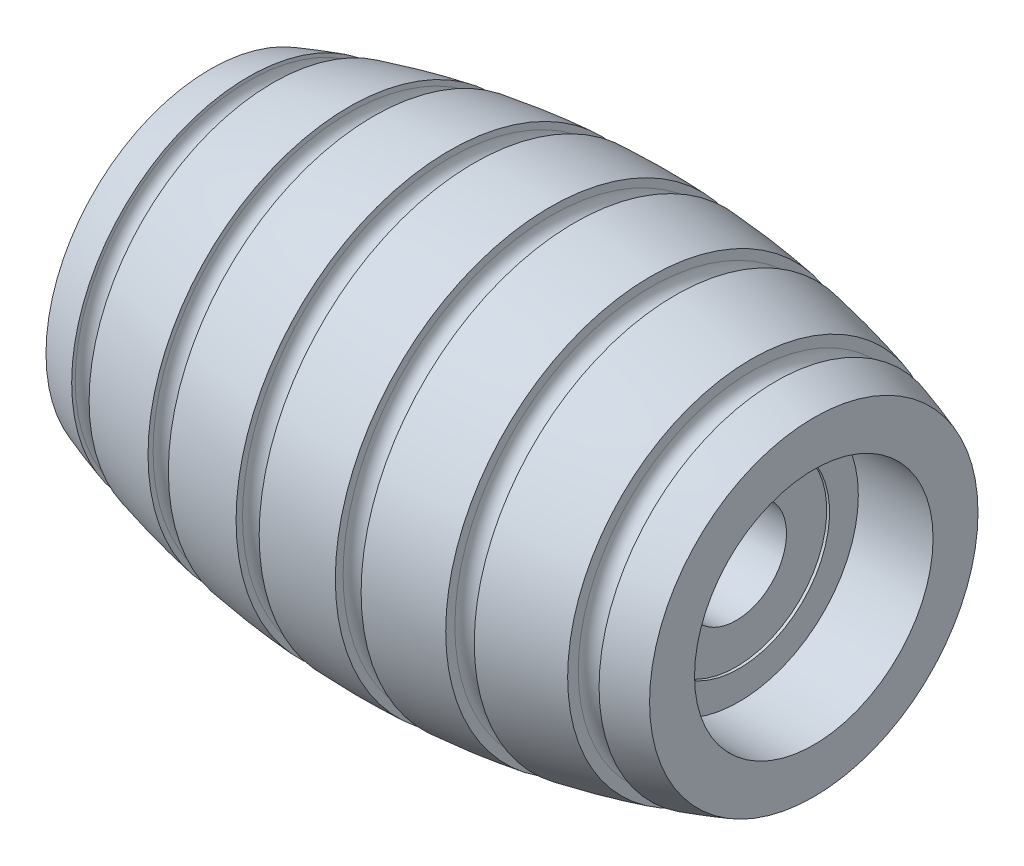
ISO-10303-21;
HEADER;
FILE_DESCRIPTION(('STEP AP214'),'2;1');
FILE_NAME('part.step','',(''),(''),'','','');
FILE_SCHEMA(('AUTOMOTIVE_DESIGN { 1 0 10303 214 1 1 1 1 }'));
ENDSEC;
DATA;
#1=APPLICATION_CONTEXT('core data for automotive mechanical design processes');
#2=APPLICATION_PROTOCOL_DEFINITION('international standard','automotive_design',2000,#1);
#3=PRODUCT_CONTEXT('',#1,'mechanical');
#4=PRODUCT('Part','Part','',(#3));
#5=PRODUCT_RELATED_PRODUCT_CATEGORY('part','',(#4));
#6=PRODUCT_DEFINITION_FORMATION('','',#4);
#7=PRODUCT_DEFINITION_CONTEXT('part definition',#1,'design');
#8=PRODUCT_DEFINITION('design','',#6,#7);
#9=PRODUCT_DEFINITION_SHAPE('','',#8);
#10=(LENGTH_UNIT() NAMED_UNIT(*) SI_UNIT(.MILLI.,.METRE.));
#11=(NAMED_UNIT(*) PLANE_ANGLE_UNIT() SI_UNIT($,.RADIAN.));
#12=(NAMED_UNIT(*) SI_UNIT($,.STERADIAN.) SOLID_ANGLE_UNIT());
#13=UNCERTAINTY_MEASURE_WITH_UNIT(LENGTH_MEASURE(1.E-05),#10,'distance_accuracy_value','');
#14=(GEOMETRIC_REPRESENTATION_CONTEXT(3) GLOBAL_UNCERTAINTY_ASSIGNED_CONTEXT((#13)) GLOBAL_UNIT_ASSIGNED_CONTEXT((#10,
#11,#12)) REPRESENTATION_CONTEXT('',''));
#15=CARTESIAN_POINT('',(0.,0.,0.));
#16=DIRECTION('',(0.,0.,1.));
#17=DIRECTION('',(1.,0.,0.));
#18=AXIS2_PLACEMENT_3D('',#15,#16,#17);
#19=CARTESIAN_POINT('',(0.,0.,0.));
#20=DIRECTION('',(-1.,0.,0.));
#21=DIRECTION('',(0.,0.,1.));
#22=AXIS2_PLACEMENT_3D('',#19,#20,#21);
#23=DEGENERATE_TOROIDAL_SURFACE('',#22,48.5,63.5,.F.);
#24=CARTESIAN_POINT('',(-21.,0.,0.));
#25=DIRECTION('',(-1.,0.,0.));
#26=DIRECTION('',(0.,0.,1.));
#27=AXIS2_PLACEMENT_3D('',#24,#25,#26);
#28=CIRCLE('',#27,11.4270389724038);
#29=CARTESIAN_POINT('',(-21.,0.,11.4270389724038));
#30=VERTEX_POINT('',#29);
#31=EDGE_CURVE('E143',#30,#30,#28,.T.);
#32=ORIENTED_EDGE('',*,*,#31,.F.);
#33=EDGE_LOOP('',(#32));
#34=FACE_BOUND('',#33,.T.);
#35=CARTESIAN_POINT('',(-18.35,0.,0.));
#36=DIRECTION('',(-1.,0.,0.));
#37=DIRECTION('',(0.,0.,1.));
#38=AXIS2_PLACEMENT_3D('',#35,#36,#37);
#39=CIRCLE('',#38,12.290850462878);
#40=CARTESIAN_POINT('',(-18.35,0.,12.290850462878));
#41=VERTEX_POINT('',#40);
#42=EDGE_CURVE('E10',#41,#41,#39,.T.);
#43=ORIENTED_EDGE('',*,*,#42,.T.);
#44=EDGE_LOOP('',(#43));
#45=FACE_BOUND('',#44,.T.);
#46=ADVANCED_FACE('F31',(#34,#45),#23,.F.);
#47=CARTESIAN_POINT('',(-18.35,12.290850462878,0.));
#48=DIRECTION('',(-1.,0.,0.));
#49=DIRECTION('',(0.,0.,1.));
#50=AXIS2_PLACEMENT_3D('',#47,#48,#49);
#51=PLANE('',#50);
#52=ORIENTED_EDGE('',*,*,#42,.F.);
#53=EDGE_LOOP('',(#52));
#54=FACE_BOUND('',#53,.T.);
#55=CARTESIAN_POINT('',(-18.35,0.,0.));
#56=DIRECTION('',(-1.,0.,0.));
#57=DIRECTION('',(0.,0.,1.));
#58=AXIS2_PLACEMENT_3D('',#55,#56,#57);
#59=CIRCLE('',#58,12.0409698481274);
#60=CARTESIAN_POINT('',(-18.35,0.,12.0409698481274));
#61=VERTEX_POINT('',#60);
#62=EDGE_CURVE('E37',#61,#61,#59,.T.);
#63=ORIENTED_EDGE('',*,*,#62,.T.);
#64=EDGE_LOOP('',(#63));
#65=FACE_BOUND('',#64,.T.);
#66=ADVANCED_FACE('F150',(#54,#65),#51,.F.);
#67=CARTESIAN_POINT('',(-17.5,0.,0.));
#68=DIRECTION('',(-1.,0.,0.));
#69=DIRECTION('',(0.,0.,1.));
#70=AXIS2_PLACEMENT_3D('',#67,#68,#69);
#71=TOROIDAL_SURFACE('',#70,12.0409698481274,0.85);
#72=ORIENTED_EDGE('',*,*,#62,.F.);
#73=EDGE_LOOP('',(#72));
#74=FACE_BOUND('',#73,.T.);
#75=CARTESIAN_POINT('',(-16.65,0.,0.));
#76=DIRECTION('',(-1.,0.,0.));
#77=DIRECTION('',(0.,0.,1.));
#78=AXIS2_PLACEMENT_3D('',#75,#76,#77);
#79=CIRCLE('',#78,12.0409698481274);
#80=CARTESIAN_POINT('',(-16.65,0.,12.0409698481274));
#81=VERTEX_POINT('',#80);
#82=EDGE_CURVE('E41',#81,#81,#79,.T.);
#83=ORIENTED_EDGE('',*,*,#82,.T.);
#84=EDGE_LOOP('',(#83));
#85=FACE_BOUND('',#84,.T.);
#86=ADVANCED_FACE('F154',(#74,#85),#71,.F.);
#87=CARTESIAN_POINT('',(-16.65,12.0409698481274,0.));
#88=DIRECTION('',(1.,0.,0.));
#89=DIRECTION('',(0.,0.,-1.));
#90=AXIS2_PLACEMENT_3D('',#87,#88,#89);
#91=PLANE('',#90);
#92=ORIENTED_EDGE('',*,*,#82,.F.);
#93=EDGE_LOOP('',(#92));
#94=FACE_BOUND('',#93,.T.);
#95=CARTESIAN_POINT('',(-16.65,0.,0.));
#96=DIRECTION('',(-1.,0.,0.));
#97=DIRECTION('',(0.,0.,1.));
#98=AXIS2_PLACEMENT_3D('',#95,#96,#97);
#99=CIRCLE('',#98,12.7782791860215);
#100=CARTESIAN_POINT('',(-16.65,0.,12.7782791860215));
#101=VERTEX_POINT('',#100);
#102=EDGE_CURVE('E45',#101,#101,#99,.T.);
#103=ORIENTED_EDGE('',*,*,#102,.T.);
#104=EDGE_LOOP('',(#103));
#105=FACE_BOUND('',#104,.T.);
#106=ADVANCED_FACE('F159',(#94,#105),#91,.F.);
#107=CARTESIAN_POINT('',(0.,0.,0.));
#108=DIRECTION('',(-1.,0.,0.));
#109=DIRECTION('',(0.,0.,1.));
#110=AXIS2_PLACEMENT_3D('',#107,#108,#109);
#111=DEGENERATE_TOROIDAL_SURFACE('',#110,48.5,63.5,.F.);
#112=ORIENTED_EDGE('',*,*,#102,.F.);
#113=EDGE_LOOP('',(#112));
#114=FACE_BOUND('',#113,.T.);
#115=CARTESIAN_POINT('',(-11.35,0.,0.));
#116=DIRECTION('',(-1.,0.,0.));
#117=DIRECTION('',(0.,0.,1.));
#118=AXIS2_PLACEMENT_3D('',#115,#116,#117);
#119=CIRCLE('',#118,13.9774159196745);
#120=CARTESIAN_POINT('',(-11.35,0.,13.9774159196745));
#121=VERTEX_POINT('',#120);
#122=EDGE_CURVE('E50',#121,#121,#119,.T.);
#123=ORIENTED_EDGE('',*,*,#122,.T.);
#124=EDGE_LOOP('',(#123));
#125=FACE_BOUND('',#124,.T.);
#126=ADVANCED_FACE('F165',(#114,#125),#111,.F.);
#127=CARTESIAN_POINT('',(-11.35,13.9774159196745,0.));
#128=DIRECTION('',(-1.,0.,0.));
#129=DIRECTION('',(0.,0.,1.));
#130=AXIS2_PLACEMENT_3D('',#127,#128,#129);
#131=PLANE('',#130);
#132=ORIENTED_EDGE('',*,*,#122,.F.);
#133=EDGE_LOOP('',(#132));
#134=FACE_BOUND('',#133,.T.);
#135=CARTESIAN_POINT('',(-11.35,0.,0.));
#136=DIRECTION('',(-1.,0.,0.));
#137=DIRECTION('',(0.,0.,1.));
#138=AXIS2_PLACEMENT_3D('',#135,#136,#137);
#139=CIRCLE('',#138,13.6258732474047);
#140=CARTESIAN_POINT('',(-11.35,0.,13.6258732474047));
#141=VERTEX_POINT('',#140);
#142=EDGE_CURVE('E53',#141,#141,#139,.T.);
#143=ORIENTED_EDGE('',*,*,#142,.T.);
#144=EDGE_LOOP('',(#143));
#145=FACE_BOUND('',#144,.T.);
#146=ADVANCED_FACE('F169',(#134,#145),#131,.F.);
#147=CARTESIAN_POINT('',(-10.5,0.,0.));
#148=DIRECTION('',(-1.,0.,0.));
#149=DIRECTION('',(0.,0.,1.));
#150=AXIS2_PLACEMENT_3D('',#147,#148,#149);
#151=TOROIDAL_SURFACE('',#150,13.6258732474047,0.85);
#152=ORIENTED_EDGE('',*,*,#142,.F.);
#153=EDGE_LOOP('',(#152));
#154=FACE_BOUND('',#153,.T.);
#155=CARTESIAN_POINT('',(-9.65,0.,0.));
#156=DIRECTION('',(-1.,0.,0.));
#157=DIRECTION('',(0.,0.,1.));
#158=AXIS2_PLACEMENT_3D('',#155,#156,#157);
#159=CIRCLE('',#158,13.6258732474047);
#160=CARTESIAN_POINT('',(-9.65,0.,13.6258732474047));
#161=VERTEX_POINT('',#160);
#162=EDGE_CURVE('E56',#161,#161,#159,.T.);
#163=ORIENTED_EDGE('',*,*,#162,.T.);
#164=EDGE_LOOP('',(#163));
#165=FACE_BOUND('',#164,.T.);
#166=ADVANCED_FACE('F173',(#154,#165),#151,.F.);
#167=CARTESIAN_POINT('',(-9.65,13.6258732474047,0.));
#168=DIRECTION('',(1.,0.,0.));
#169=DIRECTION('',(0.,0.,-1.));
#170=AXIS2_PLACEMENT_3D('',#167,#168,#169);
#171=PLANE('',#170);
#172=ORIENTED_EDGE('',*,*,#162,.F.);
#173=EDGE_LOOP('',(#172));
#174=FACE_BOUND('',#173,.T.);
#175=CARTESIAN_POINT('',(-9.65,0.,0.));
#176=DIRECTION('',(-1.,0.,0.));
#177=DIRECTION('',(0.,0.,1.));
#178=AXIS2_PLACEMENT_3D('',#175,#176,#177);
#179=CIRCLE('',#178,14.2624688806933);
#180=CARTESIAN_POINT('',(-9.65,0.,14.2624688806933));
#181=VERTEX_POINT('',#180);
#182=EDGE_CURVE('E59',#181,#181,#179,.T.);
#183=ORIENTED_EDGE('',*,*,#182,.T.);
#184=EDGE_LOOP('',(#183));
#185=FACE_BOUND('',#184,.T.);
#186=ADVANCED_FACE('F177',(#174,#185),#171,.F.);
#187=CARTESIAN_POINT('',(0.,0.,0.));
#188=DIRECTION('',(-1.,0.,0.));
#189=DIRECTION('',(0.,0.,1.));
#190=AXIS2_PLACEMENT_3D('',#187,#188,#189);
#191=DEGENERATE_TOROIDAL_SURFACE('',#190,48.5,63.5,.F.);
#192=ORIENTED_EDGE('',*,*,#182,.F.);
#193=EDGE_LOOP('',(#192));
#194=FACE_BOUND('',#193,.T.);
#195=CARTESIAN_POINT('',(-4.35,0.,0.));
#196=DIRECTION('',(-1.,0.,0.));
#197=DIRECTION('',(0.,0.,1.));
#198=AXIS2_PLACEMENT_3D('',#195,#196,#197);
#199=CIRCLE('',#198,14.8508287238612);
#200=CARTESIAN_POINT('',(-4.35,0.,14.8508287238612));
#201=VERTEX_POINT('',#200);
#202=EDGE_CURVE('E62',#201,#201,#199,.T.);
#203=ORIENTED_EDGE('',*,*,#202,.T.);
#204=EDGE_LOOP('',(#203));
#205=FACE_BOUND('',#204,.T.);
#206=ADVANCED_FACE('F181',(#194,#205),#191,.F.);
#207=CARTESIAN_POINT('',(-4.35,14.8508287238612,0.));
#208=DIRECTION('',(-1.,0.,0.));
#209=DIRECTION('',(0.,0.,1.));
#210=AXIS2_PLACEMENT_3D('',#207,#208,#209);
#211=PLANE('',#210);
#212=ORIENTED_EDGE('',*,*,#202,.F.);
#213=EDGE_LOOP('',(#212));
#214=FACE_BOUND('',#213,.T.);
#215=CARTESIAN_POINT('',(-4.35,0.,0.));
#216=DIRECTION('',(-1.,0.,0.));
#217=DIRECTION('',(0.,0.,1.));
#218=AXIS2_PLACEMENT_3D('',#215,#216,#217);
#219=CIRCLE('',#218,14.4034699365894);
#220=CARTESIAN_POINT('',(-4.35,0.,14.4034699365894));
#221=VERTEX_POINT('',#220);
#222=EDGE_CURVE('E65',#221,#221,#219,.T.);
#223=ORIENTED_EDGE('',*,*,#222,.T.);
#224=EDGE_LOOP('',(#223));
#225=FACE_BOUND('',#224,.T.);
#226=ADVANCED_FACE('F185',(#214,#225),#211,.F.);
#227=CARTESIAN_POINT('',(-3.5,0.,0.));
#228=DIRECTION('',(-1.,0.,0.));
#229=DIRECTION('',(0.,0.,1.));
#230=AXIS2_PLACEMENT_3D('',#227,#228,#229);
#231=TOROIDAL_SURFACE('',#230,14.4034699365894,0.849999999999998);
#232=ORIENTED_EDGE('',*,*,#222,.F.);
#233=EDGE_LOOP('',(#232));
#234=FACE_BOUND('',#233,.T.);
#235=CARTESIAN_POINT('',(-2.65000000000001,0.,0.));
#236=DIRECTION('',(-1.,0.,0.));
#237=DIRECTION('',(0.,0.,1.));
#238=AXIS2_PLACEMENT_3D('',#235,#236,#237);
#239=CIRCLE('',#238,14.4034699365894);
#240=CARTESIAN_POINT('',(-2.65000000000001,0.,14.4034699365894));
#241=VERTEX_POINT('',#240);
#242=EDGE_CURVE('E68',#241,#241,#239,.T.);
#243=ORIENTED_EDGE('',*,*,#242,.T.);
#244=EDGE_LOOP('',(#243));
#245=FACE_BOUND('',#244,.T.);
#246=ADVANCED_FACE('F189',(#234,#245),#231,.F.);
#247=CARTESIAN_POINT('',(-2.65,14.4034699365894,0.));
#248=DIRECTION('',(1.,0.,0.));
#249=DIRECTION('',(0.,0.,-1.));
#250=AXIS2_PLACEMENT_3D('',#247,#248,#249);
#251=PLANE('',#250);
#252=ORIENTED_EDGE('',*,*,#242,.F.);
#253=EDGE_LOOP('',(#252));
#254=FACE_BOUND('',#253,.T.);
#255=CARTESIAN_POINT('',(-2.65,0.,0.));
#256=DIRECTION('',(-1.,0.,0.));
#257=DIRECTION('',(0.,0.,1.));
#258=AXIS2_PLACEMENT_3D('',#255,#256,#257);
#259=CIRCLE('',#258,14.9446806280873);
#260=CARTESIAN_POINT('',(-2.65,0.,14.9446806280873));
#261=VERTEX_POINT('',#260);
#262=EDGE_CURVE('E71',#261,#261,#259,.T.);
#263=ORIENTED_EDGE('',*,*,#262,.T.);
#264=EDGE_LOOP('',(#263));
#265=FACE_BOUND('',#264,.T.);
#266=ADVANCED_FACE('F193',(#254,#265),#251,.F.);
#267=CARTESIAN_POINT('',(0.,0.,0.));
#268=DIRECTION('',(-1.,0.,0.));
#269=DIRECTION('',(0.,0.,1.));
#270=AXIS2_PLACEMENT_3D('',#267,#268,#269);
#271=DEGENERATE_TOROIDAL_SURFACE('',#270,48.5,63.5,.F.);
#272=ORIENTED_EDGE('',*,*,#262,.F.);
#273=EDGE_LOOP('',(#272));
#274=FACE_BOUND('',#273,.T.);
#275=CARTESIAN_POINT('',(2.65,0.,0.));
#276=DIRECTION('',(-1.,0.,0.));
#277=DIRECTION('',(0.,0.,1.));
#278=AXIS2_PLACEMENT_3D('',#275,#276,#277);
#279=CIRCLE('',#278,14.9446806280873);
#280=CARTESIAN_POINT('',(2.65,0.,14.9446806280873));
#281=VERTEX_POINT('',#280);
#282=EDGE_CURVE('E74',#281,#281,#279,.T.);
#283=ORIENTED_EDGE('',*,*,#282,.T.);
#284=EDGE_LOOP('',(#283));
#285=FACE_BOUND('',#284,.T.);
#286=ADVANCED_FACE('F197',(#274,#285),#271,.F.);
#287=CARTESIAN_POINT('',(2.65,14.9446806280873,0.));
#288=DIRECTION('',(-1.,0.,0.));
#289=DIRECTION('',(0.,0.,1.));
#290=AXIS2_PLACEMENT_3D('',#287,#288,#289);
#291=PLANE('',#290);
#292=ORIENTED_EDGE('',*,*,#282,.F.);
#293=EDGE_LOOP('',(#292));
#294=FACE_BOUND('',#293,.T.);
#295=CARTESIAN_POINT('',(2.65,0.,0.));
#296=DIRECTION('',(-1.,0.,0.));
#297=DIRECTION('',(0.,0.,1.));
#298=AXIS2_PLACEMENT_3D('',#295,#296,#297);
#299=CIRCLE('',#298,14.4034699365894);
#300=CARTESIAN_POINT('',(2.65,0.,14.4034699365894));
#301=VERTEX_POINT('',#300);
#302=EDGE_CURVE('E77',#301,#301,#299,.T.);
#303=ORIENTED_EDGE('',*,*,#302,.T.);
#304=EDGE_LOOP('',(#303));
#305=FACE_BOUND('',#304,.T.);
#306=ADVANCED_FACE('F201',(#294,#305),#291,.F.);
#307=CARTESIAN_POINT('',(3.5,0.,0.));
#308=DIRECTION('',(-1.,0.,0.));
#309=DIRECTION('',(0.,0.,1.));
#310=AXIS2_PLACEMENT_3D('',#307,#308,#309);
#311=TOROIDAL_SURFACE('',#310,14.4034699365894,0.850000000000002);
#312=ORIENTED_EDGE('',*,*,#302,.F.);
#313=EDGE_LOOP('',(#312));
#314=FACE_BOUND('',#313,.T.);
#315=CARTESIAN_POINT('',(4.35,0.,0.));
#316=DIRECTION('',(-1.,0.,0.));
#317=DIRECTION('',(0.,0.,1.));
#318=AXIS2_PLACEMENT_3D('',#315,#316,#317);
#319=CIRCLE('',#318,14.4034699365894);
#320=CARTESIAN_POINT('',(4.35,0.,14.4034699365894));
#321=VERTEX_POINT('',#320);
#322=EDGE_CURVE('E80',#321,#321,#319,.T.);
#323=ORIENTED_EDGE('',*,*,#322,.T.);
#324=EDGE_LOOP('',(#323));
#325=FACE_BOUND('',#324,.T.);
#326=ADVANCED_FACE('F205',(#314,#325),#311,.F.);
#327=CARTESIAN_POINT('',(4.35,14.4034699365894,0.));
#328=DIRECTION('',(1.,0.,0.));
#329=DIRECTION('',(0.,0.,-1.));
#330=AXIS2_PLACEMENT_3D('',#327,#328,#329);
#331=PLANE('',#330);
#332=ORIENTED_EDGE('',*,*,#322,.F.);
#333=EDGE_LOOP('',(#332));
#334=FACE_BOUND('',#333,.T.);
#335=CARTESIAN_POINT('',(4.35000000000001,0.,0.));
#336=DIRECTION('',(-1.,0.,0.));
#337=DIRECTION('',(0.,0.,1.));
#338=AXIS2_PLACEMENT_3D('',#335,#336,#337);
#339=CIRCLE('',#338,14.8508287238612);
#340=CARTESIAN_POINT('',(4.35000000000001,0.,14.8508287238612));
#341=VERTEX_POINT('',#340);
#342=EDGE_CURVE('E83',#341,#341,#339,.T.);
#343=ORIENTED_EDGE('',*,*,#342,.T.);
#344=EDGE_LOOP('',(#343));
#345=FACE_BOUND('',#344,.T.);
#346=ADVANCED_FACE('F209',(#334,#345),#331,.F.);
#347=CARTESIAN_POINT('',(0.,0.,0.));
#348=DIRECTION('',(-1.,0.,0.));
#349=DIRECTION('',(0.,0.,1.));
#350=AXIS2_PLACEMENT_3D('',#347,#348,#349);
#351=DEGENERATE_TOROIDAL_SURFACE('',#350,48.5,63.5,.F.);
#352=ORIENTED_EDGE('',*,*,#342,.F.);
#353=EDGE_LOOP('',(#352));
#354=FACE_BOUND('',#353,.T.);
#355=CARTESIAN_POINT('',(9.65,0.,0.));
#356=DIRECTION('',(-1.,0.,0.));
#357=DIRECTION('',(0.,0.,1.));
#358=AXIS2_PLACEMENT_3D('',#355,#356,#357);
#359=CIRCLE('',#358,14.2624688806933);
#360=CARTESIAN_POINT('',(9.65,0.,14.2624688806933));
#361=VERTEX_POINT('',#360);
#362=EDGE_CURVE('E86',#361,#361,#359,.T.);
#363=ORIENTED_EDGE('',*,*,#362,.T.);
#364=EDGE_LOOP('',(#363));
#365=FACE_BOUND('',#364,.T.);
#366=ADVANCED_FACE('F213',(#354,#365),#351,.F.);
#367=CARTESIAN_POINT('',(9.65,14.2624688806933,0.));
#368=DIRECTION('',(-1.,0.,0.));
#369=DIRECTION('',(0.,0.,1.));
#370=AXIS2_PLACEMENT_3D('',#367,#368,#369);
#371=PLANE('',#370);
#372=ORIENTED_EDGE('',*,*,#362,.F.);
#373=EDGE_LOOP('',(#372));
#374=FACE_BOUND('',#373,.T.);
#375=CARTESIAN_POINT('',(9.65,0.,0.));
#376=DIRECTION('',(-1.,0.,0.));
#377=DIRECTION('',(0.,0.,1.));
#378=AXIS2_PLACEMENT_3D('',#375,#376,#377);
#379=CIRCLE('',#378,13.6258732474047);
#380=CARTESIAN_POINT('',(9.65,0.,13.6258732474047));
#381=VERTEX_POINT('',#380);
#382=EDGE_CURVE('E89',#381,#381,#379,.T.);
#383=ORIENTED_EDGE('',*,*,#382,.T.);
#384=EDGE_LOOP('',(#383));
#385=FACE_BOUND('',#384,.T.);
#386=ADVANCED_FACE('F217',(#374,#385),#371,.F.);
#387=CARTESIAN_POINT('',(10.5,0.,0.));
#388=DIRECTION('',(-1.,0.,0.));
#389=DIRECTION('',(0.,0.,1.));
#390=AXIS2_PLACEMENT_3D('',#387,#388,#389);
#391=TOROIDAL_SURFACE('',#390,13.6258732474047,0.85);
#392=ORIENTED_EDGE('',*,*,#382,.F.);
#393=EDGE_LOOP('',(#392));
#394=FACE_BOUND('',#393,.T.);
#395=CARTESIAN_POINT('',(11.35,0.,0.));
#396=DIRECTION('',(-1.,0.,0.));
#397=DIRECTION('',(0.,0.,1.));
#398=AXIS2_PLACEMENT_3D('',#395,#396,#397);
#399=CIRCLE('',#398,13.6258732474047);
#400=CARTESIAN_POINT('',(11.35,0.,13.6258732474047));
#401=VERTEX_POINT('',#400);
#402=EDGE_CURVE('E92',#401,#401,#399,.T.);
#403=ORIENTED_EDGE('',*,*,#402,.T.);
#404=EDGE_LOOP('',(#403));
#405=FACE_BOUND('',#404,.T.);
#406=ADVANCED_FACE('F221',(#394,#405),#391,.F.);
#407=CARTESIAN_POINT('',(11.35,13.6258732474047,0.));
#408=DIRECTION('',(1.,0.,0.));
#409=DIRECTION('',(0.,0.,-1.));
#410=AXIS2_PLACEMENT_3D('',#407,#408,#409);
#411=PLANE('',#410);
#412=ORIENTED_EDGE('',*,*,#402,.F.);
#413=EDGE_LOOP('',(#412));
#414=FACE_BOUND('',#413,.T.);
#415=CARTESIAN_POINT('',(11.35,0.,0.));
#416=DIRECTION('',(-1.,0.,0.));
#417=DIRECTION('',(0.,0.,1.));
#418=AXIS2_PLACEMENT_3D('',#415,#416,#417);
#419=CIRCLE('',#418,13.9774159196745);
#420=CARTESIAN_POINT('',(11.35,0.,13.9774159196745));
#421=VERTEX_POINT('',#420);
#422=EDGE_CURVE('E95',#421,#421,#419,.T.);
#423=ORIENTED_EDGE('',*,*,#422,.T.);
#424=EDGE_LOOP('',(#423));
#425=FACE_BOUND('',#424,.T.);
#426=ADVANCED_FACE('F225',(#414,#425),#411,.F.);
#427=CARTESIAN_POINT('',(0.,0.,0.));
#428=DIRECTION('',(-1.,0.,0.));
#429=DIRECTION('',(0.,0.,1.));
#430=AXIS2_PLACEMENT_3D('',#427,#428,#429);
#431=DEGENERATE_TOROIDAL_SURFACE('',#430,48.5,63.5,.F.);
#432=ORIENTED_EDGE('',*,*,#422,.F.);
#433=EDGE_LOOP('',(#432));
#434=FACE_BOUND('',#433,.T.);
#435=CARTESIAN_POINT('',(16.65,0.,0.));
#436=DIRECTION('',(-1.,0.,0.));
#437=DIRECTION('',(0.,0.,1.));
#438=AXIS2_PLACEMENT_3D('',#435,#436,#437);
#439=CIRCLE('',#438,12.7782791860215);
#440=CARTESIAN_POINT('',(16.65,0.,12.7782791860215));
#441=VERTEX_POINT('',#440);
#442=EDGE_CURVE('E98',#441,#441,#439,.T.);
#443=ORIENTED_EDGE('',*,*,#442,.T.);
#444=EDGE_LOOP('',(#443));
#445=FACE_BOUND('',#444,.T.);
#446=ADVANCED_FACE('F229',(#434,#445),#431,.F.);
#447=CARTESIAN_POINT('',(16.65,12.7782791860215,0.));
#448=DIRECTION('',(-1.,0.,0.));
#449=DIRECTION('',(0.,0.,1.));
#450=AXIS2_PLACEMENT_3D('',#447,#448,#449);
#451=PLANE('',#450);
#452=ORIENTED_EDGE('',*,*,#442,.F.);
#453=EDGE_LOOP('',(#452));
#454=FACE_BOUND('',#453,.T.);
#455=CARTESIAN_POINT('',(16.65,0.,0.));
#456=DIRECTION('',(-1.,0.,0.));
#457=DIRECTION('',(0.,0.,1.));
#458=AXIS2_PLACEMENT_3D('',#455,#456,#457);
#459=CIRCLE('',#458,12.0409698481274);
#460=CARTESIAN_POINT('',(16.65,0.,12.0409698481274));
#461=VERTEX_POINT('',#460);
#462=EDGE_CURVE('E101',#461,#461,#459,.T.);
#463=ORIENTED_EDGE('',*,*,#462,.T.);
#464=EDGE_LOOP('',(#463));
#465=FACE_BOUND('',#464,.T.);
#466=ADVANCED_FACE('F233',(#454,#465),#451,.F.);
#467=CARTESIAN_POINT('',(17.5,0.,0.));
#468=DIRECTION('',(-1.,0.,0.));
#469=DIRECTION('',(0.,0.,1.));
#470=AXIS2_PLACEMENT_3D('',#467,#468,#469);
#471=TOROIDAL_SURFACE('',#470,12.0409698481274,0.849999999999995);
#472=ORIENTED_EDGE('',*,*,#462,.F.);
#473=EDGE_LOOP('',(#472));
#474=FACE_BOUND('',#473,.T.);
#475=CARTESIAN_POINT('',(18.35,0.,0.));
#476=DIRECTION('',(-1.,0.,0.));
#477=DIRECTION('',(0.,0.,1.));
#478=AXIS2_PLACEMENT_3D('',#475,#476,#477);
#479=CIRCLE('',#478,12.0409698481274);
#480=CARTESIAN_POINT('',(18.35,0.,12.0409698481274));
#481=VERTEX_POINT('',#480);
#482=EDGE_CURVE('E104',#481,#481,#479,.T.);
#483=ORIENTED_EDGE('',*,*,#482,.T.);
#484=EDGE_LOOP('',(#483));
#485=FACE_BOUND('',#484,.T.);
#486=ADVANCED_FACE('F237',(#474,#485),#471,.F.);
#487=CARTESIAN_POINT('',(18.35,12.0409698481274,0.));
#488=DIRECTION('',(1.,0.,0.));
#489=DIRECTION('',(0.,0.,-1.));
#490=AXIS2_PLACEMENT_3D('',#487,#488,#489);
#491=PLANE('',#490);
#492=ORIENTED_EDGE('',*,*,#482,.F.);
#493=EDGE_LOOP('',(#492));
#494=FACE_BOUND('',#493,.T.);
#495=CARTESIAN_POINT('',(18.35,0.,0.));
#496=DIRECTION('',(-1.,0.,0.));
#497=DIRECTION('',(0.,0.,1.));
#498=AXIS2_PLACEMENT_3D('',#495,#496,#497);
#499=CIRCLE('',#498,12.290850462878);
#500=CARTESIAN_POINT('',(18.35,0.,12.290850462878));
#501=VERTEX_POINT('',#500);
#502=EDGE_CURVE('E107',#501,#501,#499,.T.);
#503=ORIENTED_EDGE('',*,*,#502,.T.);
#504=EDGE_LOOP('',(#503));
#505=FACE_BOUND('',#504,.T.);
#506=ADVANCED_FACE('F241',(#494,#505),#491,.F.);
#507=CARTESIAN_POINT('',(0.,0.,0.));
#508=DIRECTION('',(-1.,0.,0.));
#509=DIRECTION('',(0.,0.,1.));
#510=AXIS2_PLACEMENT_3D('',#507,#508,#509);
#511=DEGENERATE_TOROIDAL_SURFACE('',#510,48.5,63.5,.F.);
#512=ORIENTED_EDGE('',*,*,#502,.F.);
#513=EDGE_LOOP('',(#512));
#514=FACE_BOUND('',#513,.T.);
#515=CARTESIAN_POINT('',(21.,0.,0.));
#516=DIRECTION('',(-1.,0.,0.));
#517=DIRECTION('',(0.,0.,1.));
#518=AXIS2_PLACEMENT_3D('',#515,#516,#517);
#519=CIRCLE('',#518,11.4270389724038);
#520=CARTESIAN_POINT('',(21.,0.,11.4270389724038));
#521=VERTEX_POINT('',#520);
#522=EDGE_CURVE('E110',#521,#521,#519,.T.);
#523=ORIENTED_EDGE('',*,*,#522,.T.);
#524=EDGE_LOOP('',(#523));
#525=FACE_BOUND('',#524,.T.);
#526=ADVANCED_FACE('F245',(#514,#525),#511,.F.);
#527=CARTESIAN_POINT('',(21.,8.3,0.));
#528=DIRECTION('',(-1.,0.,0.));
#529=DIRECTION('',(0.,0.,1.));
#530=AXIS2_PLACEMENT_3D('',#527,#528,#529);
#531=PLANE('',#530);
#532=ORIENTED_EDGE('',*,*,#522,.F.);
#533=EDGE_LOOP('',(#532));
#534=FACE_BOUND('',#533,.T.);
#535=CARTESIAN_POINT('',(21.,0.,0.));
#536=DIRECTION('',(-1.,0.,0.));
#537=DIRECTION('',(0.,0.,1.));
#538=AXIS2_PLACEMENT_3D('',#535,#536,#537);
#539=CIRCLE('',#538,8.3);
#540=CARTESIAN_POINT('',(21.,0.,8.3));
#541=VERTEX_POINT('',#540);
#542=EDGE_CURVE('E113',#541,#541,#539,.T.);
#543=ORIENTED_EDGE('',*,*,#542,.T.);
#544=EDGE_LOOP('',(#543));
#545=FACE_BOUND('',#544,.T.);
#546=ADVANCED_FACE('F249',(#534,#545),#531,.F.);
#547=CARTESIAN_POINT('',(-24.5,0.,0.));
#548=DIRECTION('',(-1.,0.,0.));
#549=DIRECTION('',(0.,0.,1.));
#550=AXIS2_PLACEMENT_3D('',#547,#548,#549);
#551=CYLINDRICAL_SURFACE('',#550,8.3);
#552=ORIENTED_EDGE('',*,*,#542,.F.);
#553=EDGE_LOOP('',(#552));
#554=FACE_BOUND('',#553,.T.);
#555=CARTESIAN_POINT('',(15.8,0.,0.));
#556=DIRECTION('',(-1.,0.,0.));
#557=DIRECTION('',(0.,0.,1.));
#558=AXIS2_PLACEMENT_3D('',#555,#556,#557);
#559=CIRCLE('',#558,8.3);
#560=CARTESIAN_POINT('',(15.8,0.,8.3));
#561=VERTEX_POINT('',#560);
#562=EDGE_CURVE('E116',#561,#561,#559,.T.);
#563=ORIENTED_EDGE('',*,*,#562,.T.);
#564=EDGE_LOOP('',(#563));
#565=FACE_BOUND('',#564,.T.);
#566=ADVANCED_FACE('F253',(#554,#565),#551,.F.);
#567=CARTESIAN_POINT('',(15.8,6.3,0.));
#568=DIRECTION('',(-1.,0.,0.));
#569=DIRECTION('',(0.,0.,1.));
#570=AXIS2_PLACEMENT_3D('',#567,#568,#569);
#571=PLANE('',#570);
#572=ORIENTED_EDGE('',*,*,#562,.F.);
#573=EDGE_LOOP('',(#572));
#574=FACE_BOUND('',#573,.T.);
#575=CARTESIAN_POINT('',(15.8,0.,0.));
#576=DIRECTION('',(-1.,0.,0.));
#577=DIRECTION('',(0.,0.,1.));
#578=AXIS2_PLACEMENT_3D('',#575,#576,#577);
#579=CIRCLE('',#578,6.3);
#580=CARTESIAN_POINT('',(15.8,0.,6.3));
#581=VERTEX_POINT('',#580);
#582=EDGE_CURVE('E119',#581,#581,#579,.T.);
#583=ORIENTED_EDGE('',*,*,#582,.T.);
#584=EDGE_LOOP('',(#583));
#585=FACE_BOUND('',#584,.T.);
#586=ADVANCED_FACE('F257',(#574,#585),#571,.F.);
#587=CARTESIAN_POINT('',(-24.5,0.,0.));
#588=DIRECTION('',(-1.,0.,0.));
#589=DIRECTION('',(0.,0.,1.));
#590=AXIS2_PLACEMENT_3D('',#587,#588,#589);
#591=CYLINDRICAL_SURFACE('',#590,6.3);
#592=ORIENTED_EDGE('',*,*,#582,.F.);
#593=EDGE_LOOP('',(#592));
#594=FACE_BOUND('',#593,.T.);
#595=CARTESIAN_POINT('',(15.6,0.,0.));
#596=DIRECTION('',(-1.,0.,0.));
#597=DIRECTION('',(0.,0.,1.));
#598=AXIS2_PLACEMENT_3D('',#595,#596,#597);
#599=CIRCLE('',#598,6.3);
#600=CARTESIAN_POINT('',(15.6,0.,6.3));
#601=VERTEX_POINT('',#600);
#602=EDGE_CURVE('E122',#601,#601,#599,.T.);
#603=ORIENTED_EDGE('',*,*,#602,.T.);
#604=EDGE_LOOP('',(#603));
#605=FACE_BOUND('',#604,.T.);
#606=ADVANCED_FACE('F261',(#594,#605),#591,.F.);
#607=CARTESIAN_POINT('',(15.6,3.5,0.));
#608=DIRECTION('',(-1.,0.,0.));
#609=DIRECTION('',(0.,0.,1.));
#610=AXIS2_PLACEMENT_3D('',#607,#608,#609);
#611=PLANE('',#610);
#612=ORIENTED_EDGE('',*,*,#602,.F.);
#613=EDGE_LOOP('',(#612));
#614=FACE_BOUND('',#613,.T.);
#615=CARTESIAN_POINT('',(15.6,0.,0.));
#616=DIRECTION('',(-1.,0.,0.));
#617=DIRECTION('',(0.,0.,1.));
#618=AXIS2_PLACEMENT_3D('',#615,#616,#617);
#619=CIRCLE('',#618,3.5);
#620=CARTESIAN_POINT('',(15.6,0.,3.5));
#621=VERTEX_POINT('',#620);
#622=EDGE_CURVE('E125',#621,#621,#619,.T.);
#623=ORIENTED_EDGE('',*,*,#622,.T.);
#624=EDGE_LOOP('',(#623));
#625=FACE_BOUND('',#624,.T.);
#626=ADVANCED_FACE('F265',(#614,#625),#611,.F.);
#627=CARTESIAN_POINT('',(-24.5,0.,0.));
#628=DIRECTION('',(-1.,0.,0.));
#629=DIRECTION('',(0.,0.,1.));
#630=AXIS2_PLACEMENT_3D('',#627,#628,#629);
#631=CYLINDRICAL_SURFACE('',#630,3.5);
#632=ORIENTED_EDGE('',*,*,#622,.F.);
#633=EDGE_LOOP('',(#632));
#634=FACE_BOUND('',#633,.T.);
#635=CARTESIAN_POINT('',(-15.6,0.,0.));
#636=DIRECTION('',(-1.,0.,0.));
#637=DIRECTION('',(0.,0.,1.));
#638=AXIS2_PLACEMENT_3D('',#635,#636,#637);
#639=CIRCLE('',#638,3.5);
#640=CARTESIAN_POINT('',(-15.6,0.,3.5));
#641=VERTEX_POINT('',#640);
#642=EDGE_CURVE('E128',#641,#641,#639,.T.);
#643=ORIENTED_EDGE('',*,*,#642,.T.);
#644=EDGE_LOOP('',(#643));
#645=FACE_BOUND('',#644,.T.);
#646=ADVANCED_FACE('F269',(#634,#645),#631,.F.);
#647=CARTESIAN_POINT('',(-15.6,6.3,0.));
#648=DIRECTION('',(1.,0.,0.));
#649=DIRECTION('',(0.,0.,-1.));
#650=AXIS2_PLACEMENT_3D('',#647,#648,#649);
#651=PLANE('',#650);
#652=ORIENTED_EDGE('',*,*,#642,.F.);
#653=EDGE_LOOP('',(#652));
#654=FACE_BOUND('',#653,.T.);
#655=CARTESIAN_POINT('',(-15.6,0.,0.));
#656=DIRECTION('',(-1.,0.,0.));
#657=DIRECTION('',(0.,0.,1.));
#658=AXIS2_PLACEMENT_3D('',#655,#656,#657);
#659=CIRCLE('',#658,6.3);
#660=CARTESIAN_POINT('',(-15.6,0.,6.3));
#661=VERTEX_POINT('',#660);
#662=EDGE_CURVE('E131',#661,#661,#659,.T.);
#663=ORIENTED_EDGE('',*,*,#662,.T.);
#664=EDGE_LOOP('',(#663));
#665=FACE_BOUND('',#664,.T.);
#666=ADVANCED_FACE('F273',(#654,#665),#651,.F.);
#667=CARTESIAN_POINT('',(-24.5,0.,0.));
#668=DIRECTION('',(-1.,0.,0.));
#669=DIRECTION('',(0.,0.,1.));
#670=AXIS2_PLACEMENT_3D('',#667,#668,#669);
#671=CYLINDRICAL_SURFACE('',#670,6.3);
#672=ORIENTED_EDGE('',*,*,#662,.F.);
#673=EDGE_LOOP('',(#672));
#674=FACE_BOUND('',#673,.T.);
#675=CARTESIAN_POINT('',(-15.8,0.,0.));
#676=DIRECTION('',(-1.,0.,0.));
#677=DIRECTION('',(0.,0.,1.));
#678=AXIS2_PLACEMENT_3D('',#675,#676,#677);
#679=CIRCLE('',#678,6.3);
#680=CARTESIAN_POINT('',(-15.8,0.,6.3));
#681=VERTEX_POINT('',#680);
#682=EDGE_CURVE('E134',#681,#681,#679,.T.);
#683=ORIENTED_EDGE('',*,*,#682,.T.);
#684=EDGE_LOOP('',(#683));
#685=FACE_BOUND('',#684,.T.);
#686=ADVANCED_FACE('F277',(#674,#685),#671,.F.);
#687=CARTESIAN_POINT('',(-15.8,8.3,0.));
#688=DIRECTION('',(1.,0.,0.));
#689=DIRECTION('',(0.,0.,-1.));
#690=AXIS2_PLACEMENT_3D('',#687,#688,#689);
#691=PLANE('',#690);
#692=ORIENTED_EDGE('',*,*,#682,.F.);
#693=EDGE_LOOP('',(#692));
#694=FACE_BOUND('',#693,.T.);
#695=CARTESIAN_POINT('',(-15.8,0.,0.));
#696=DIRECTION('',(-1.,0.,0.));
#697=DIRECTION('',(0.,0.,1.));
#698=AXIS2_PLACEMENT_3D('',#695,#696,#697);
#699=CIRCLE('',#698,8.3);
#700=CARTESIAN_POINT('',(-15.8,0.,8.3));
#701=VERTEX_POINT('',#700);
#702=EDGE_CURVE('E137',#701,#701,#699,.T.);
#703=ORIENTED_EDGE('',*,*,#702,.T.);
#704=EDGE_LOOP('',(#703));
#705=FACE_BOUND('',#704,.T.);
#706=ADVANCED_FACE('F281',(#694,#705),#691,.F.);
#707=CARTESIAN_POINT('',(-24.5,0.,0.));
#708=DIRECTION('',(-1.,0.,0.));
#709=DIRECTION('',(0.,0.,1.));
#710=AXIS2_PLACEMENT_3D('',#707,#708,#709);
#711=CYLINDRICAL_SURFACE('',#710,8.3);
#712=ORIENTED_EDGE('',*,*,#702,.F.);
#713=EDGE_LOOP('',(#712));
#714=FACE_BOUND('',#713,.T.);
#715=CARTESIAN_POINT('',(-21.,0.,0.));
#716=DIRECTION('',(-1.,0.,0.));
#717=DIRECTION('',(0.,0.,1.));
#718=AXIS2_PLACEMENT_3D('',#715,#716,#717);
#719=CIRCLE('',#718,8.3);
#720=CARTESIAN_POINT('',(-21.,0.,8.3));
#721=VERTEX_POINT('',#720);
#722=EDGE_CURVE('E140',#721,#721,#719,.T.);
#723=ORIENTED_EDGE('',*,*,#722,.T.);
#724=EDGE_LOOP('',(#723));
#725=FACE_BOUND('',#724,.T.);
#726=ADVANCED_FACE('F285',(#714,#725),#711,.F.);
#727=CARTESIAN_POINT('',(-21.,11.4270389724038,0.));
#728=DIRECTION('',(1.,0.,0.));
#729=DIRECTION('',(0.,0.,-1.));
#730=AXIS2_PLACEMENT_3D('',#727,#728,#729);
#731=PLANE('',#730);
#732=ORIENTED_EDGE('',*,*,#722,.F.);
#733=EDGE_LOOP('',(#732));
#734=FACE_BOUND('',#733,.T.);
#735=ORIENTED_EDGE('',*,*,#31,.T.);
#736=EDGE_LOOP('',(#735));
#737=FACE_BOUND('',#736,.T.);
#738=ADVANCED_FACE('F147',(#734,#737),#731,.F.);
#739=CLOSED_SHELL('',(#46,#66,#86,#106,#126,#146,#166,#186,#206,#226,#246,#266,#286,#306,#326,
#346,#366,#386,#406,#426,#446,#466,#486,#506,#526,#546,#566,#586,#606,#626,#646,#666,#686,#706,
#726,#738));
#740=MANIFOLD_SOLID_BREP('B2',#739);
#741=ADVANCED_BREP_SHAPE_REPRESENTATION('',(#18,#740),#14);
#742=SHAPE_DEFINITION_REPRESENTATION(#9,#741);
ENDSEC;
END-ISO-10303-21;
